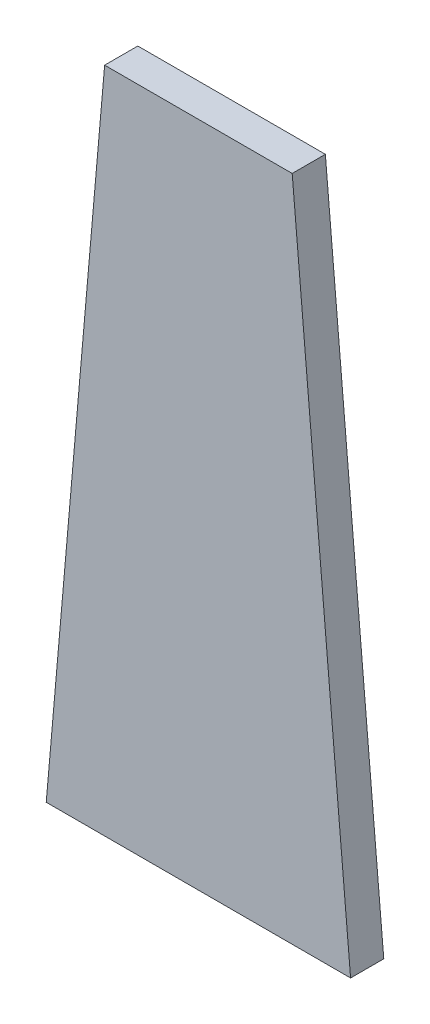
ISO-10303-21;
HEADER;
FILE_DESCRIPTION(('STEP AP214'),'2;1');
FILE_NAME('part.step','',(''),(''),'','','');
FILE_SCHEMA(('AUTOMOTIVE_DESIGN { 1 0 10303 214 1 1 1 1 }'));
ENDSEC;
DATA;
#1=APPLICATION_CONTEXT('core data for automotive mechanical design processes');
#2=APPLICATION_PROTOCOL_DEFINITION('international standard','automotive_design',2000,#1);
#3=PRODUCT_CONTEXT('',#1,'mechanical');
#4=PRODUCT('Part','Part','',(#3));
#5=PRODUCT_RELATED_PRODUCT_CATEGORY('part','',(#4));
#6=PRODUCT_DEFINITION_FORMATION('','',#4);
#7=PRODUCT_DEFINITION_CONTEXT('part definition',#1,'design');
#8=PRODUCT_DEFINITION('design','',#6,#7);
#9=PRODUCT_DEFINITION_SHAPE('','',#8);
#10=(LENGTH_UNIT() NAMED_UNIT(*) SI_UNIT(.MILLI.,.METRE.));
#11=(NAMED_UNIT(*) PLANE_ANGLE_UNIT() SI_UNIT($,.RADIAN.));
#12=(NAMED_UNIT(*) SI_UNIT($,.STERADIAN.) SOLID_ANGLE_UNIT());
#13=UNCERTAINTY_MEASURE_WITH_UNIT(LENGTH_MEASURE(1.E-05),#10,'distance_accuracy_value','');
#14=(GEOMETRIC_REPRESENTATION_CONTEXT(3) GLOBAL_UNCERTAINTY_ASSIGNED_CONTEXT((#13)) GLOBAL_UNIT_ASSIGNED_CONTEXT((#10,
#11,#12)) REPRESENTATION_CONTEXT('',''));
#15=CARTESIAN_POINT('',(0.,0.,0.));
#16=DIRECTION('',(0.,0.,1.));
#17=DIRECTION('',(1.,0.,0.));
#18=AXIS2_PLACEMENT_3D('',#15,#16,#17);
#19=CARTESIAN_POINT('',(-9.1740130367215,-20.121840140689,2.));
#20=DIRECTION('',(0.996194717842911,-0.0871555169905064,0.));
#21=DIRECTION('',(0.0871555169905064,0.996194717842911,0.));
#22=AXIS2_PLACEMENT_3D('',#19,#20,#21);
#23=PLANE('',#22);
#24=DIRECTION('',(-0.0871555169905064,-0.996194717842911,0.));
#25=VECTOR('',#24,1.);
#26=CARTESIAN_POINT('',(-9.1740130367215,-20.121840140689,0.));
#27=LINE('',#26,#25);
#28=CARTESIAN_POINT('',(-5.65315642334883,20.121840140689,0.));
#29=VERTEX_POINT('',#28);
#30=CARTESIAN_POINT('',(-9.1740130367215,-20.121840140689,0.));
#31=VERTEX_POINT('',#30);
#32=EDGE_CURVE('E99',#29,#31,#27,.T.);
#33=ORIENTED_EDGE('',*,*,#32,.T.);
#34=DIRECTION('',(0.,0.,-1.));
#35=VECTOR('',#34,1.);
#36=CARTESIAN_POINT('',(-9.1740130367215,-20.121840140689,2.));
#37=LINE('',#36,#35);
#38=CARTESIAN_POINT('',(-9.1740130367215,-20.121840140689,2.));
#39=VERTEX_POINT('',#38);
#40=EDGE_CURVE('E11',#39,#31,#37,.T.);
#41=ORIENTED_EDGE('',*,*,#40,.F.);
#42=DIRECTION('',(-0.0871555169905064,-0.996194717842911,0.));
#43=VECTOR('',#42,1.);
#44=CARTESIAN_POINT('',(-9.1740130367215,-20.121840140689,2.));
#45=LINE('',#44,#43);
#46=CARTESIAN_POINT('',(-5.65315642334883,20.121840140689,2.));
#47=VERTEX_POINT('',#46);
#48=EDGE_CURVE('E87',#47,#39,#45,.T.);
#49=ORIENTED_EDGE('',*,*,#48,.F.);
#50=DIRECTION('',(0.,0.,-1.));
#51=VECTOR('',#50,1.);
#52=CARTESIAN_POINT('',(-5.65315642334883,20.121840140689,2.));
#53=LINE('',#52,#51);
#54=EDGE_CURVE('E95',#47,#29,#53,.T.);
#55=ORIENTED_EDGE('',*,*,#54,.T.);
#56=EDGE_LOOP('',(#33,#41,#49,#55));
#57=FACE_BOUND('',#56,.T.);
#58=ADVANCED_FACE('F36',(#57),#23,.F.);
#59=CARTESIAN_POINT('',(9.1740130367215,-20.121840140689,2.));
#60=DIRECTION('',(0.,1.,0.));
#61=DIRECTION('',(0.,0.,1.));
#62=AXIS2_PLACEMENT_3D('',#59,#60,#61);
#63=PLANE('',#62);
#64=DIRECTION('',(1.,0.,0.));
#65=VECTOR('',#64,1.);
#66=CARTESIAN_POINT('',(9.1740130367215,-20.121840140689,0.));
#67=LINE('',#66,#65);
#68=CARTESIAN_POINT('',(9.1740130367215,-20.121840140689,0.));
#69=VERTEX_POINT('',#68);
#70=EDGE_CURVE('E91',#31,#69,#67,.T.);
#71=ORIENTED_EDGE('',*,*,#70,.T.);
#72=DIRECTION('',(0.,0.,-1.));
#73=VECTOR('',#72,1.);
#74=CARTESIAN_POINT('',(9.1740130367215,-20.121840140689,2.));
#75=LINE('',#74,#73);
#76=CARTESIAN_POINT('',(9.1740130367215,-20.121840140689,2.));
#77=VERTEX_POINT('',#76);
#78=EDGE_CURVE('E44',#77,#69,#75,.T.);
#79=ORIENTED_EDGE('',*,*,#78,.F.);
#80=DIRECTION('',(1.,0.,0.));
#81=VECTOR('',#80,1.);
#82=CARTESIAN_POINT('',(9.1740130367215,-20.121840140689,2.));
#83=LINE('',#82,#81);
#84=EDGE_CURVE('E82',#39,#77,#83,.T.);
#85=ORIENTED_EDGE('',*,*,#84,.F.);
#86=ORIENTED_EDGE('',*,*,#40,.T.);
#87=EDGE_LOOP('',(#71,#79,#85,#86));
#88=FACE_BOUND('',#87,.T.);
#89=ADVANCED_FACE('F90',(#88),#63,.F.);
#90=CARTESIAN_POINT('',(5.65315642330453,20.121840140689,2.));
#91=DIRECTION('',(-0.996194717842816,-0.0871555169915947,0.));
#92=DIRECTION('',(0.0871555169915947,-0.996194717842816,0.));
#93=AXIS2_PLACEMENT_3D('',#90,#91,#92);
#94=PLANE('',#93);
#95=DIRECTION('',(-0.0871555169915947,0.996194717842816,0.));
#96=VECTOR('',#95,1.);
#97=CARTESIAN_POINT('',(5.65315642330453,20.121840140689,0.));
#98=LINE('',#97,#96);
#99=CARTESIAN_POINT('',(5.65315642330453,20.121840140689,0.));
#100=VERTEX_POINT('',#99);
#101=EDGE_CURVE('E69',#69,#100,#98,.T.);
#102=ORIENTED_EDGE('',*,*,#101,.T.);
#103=DIRECTION('',(0.,0.,-1.));
#104=VECTOR('',#103,1.);
#105=CARTESIAN_POINT('',(5.65315642330453,20.121840140689,2.));
#106=LINE('',#105,#104);
#107=CARTESIAN_POINT('',(5.65315642330453,20.121840140689,2.));
#108=VERTEX_POINT('',#107);
#109=EDGE_CURVE('E92',#108,#100,#106,.T.);
#110=ORIENTED_EDGE('',*,*,#109,.F.);
#111=DIRECTION('',(-0.0871555169915947,0.996194717842816,0.));
#112=VECTOR('',#111,1.);
#113=CARTESIAN_POINT('',(5.65315642330453,20.121840140689,2.));
#114=LINE('',#113,#112);
#115=EDGE_CURVE('E85',#77,#108,#114,.T.);
#116=ORIENTED_EDGE('',*,*,#115,.F.);
#117=ORIENTED_EDGE('',*,*,#78,.T.);
#118=EDGE_LOOP('',(#102,#110,#116,#117));
#119=FACE_BOUND('',#118,.T.);
#120=ADVANCED_FACE('F93',(#119),#94,.F.);
#121=CARTESIAN_POINT('',(-5.65315642334883,20.121840140689,2.));
#122=DIRECTION('',(0.,-1.,0.));
#123=DIRECTION('',(0.,0.,-1.));
#124=AXIS2_PLACEMENT_3D('',#121,#122,#123);
#125=PLANE('',#124);
#126=DIRECTION('',(-1.,0.,0.));
#127=VECTOR('',#126,1.);
#128=CARTESIAN_POINT('',(-5.65315642334883,20.121840140689,0.));
#129=LINE('',#128,#127);
#130=EDGE_CURVE('E75',#100,#29,#129,.T.);
#131=ORIENTED_EDGE('',*,*,#130,.T.);
#132=ORIENTED_EDGE('',*,*,#54,.F.);
#133=DIRECTION('',(-1.,0.,0.));
#134=VECTOR('',#133,1.);
#135=CARTESIAN_POINT('',(-5.65315642334883,20.121840140689,2.));
#136=LINE('',#135,#134);
#137=EDGE_CURVE('E52',#108,#47,#136,.T.);
#138=ORIENTED_EDGE('',*,*,#137,.F.);
#139=ORIENTED_EDGE('',*,*,#109,.T.);
#140=EDGE_LOOP('',(#131,#132,#138,#139));
#141=FACE_BOUND('',#140,.T.);
#142=ADVANCED_FACE('F106',(#141),#125,.F.);
#143=CARTESIAN_POINT('',(0.,0.,2.));
#144=DIRECTION('',(0.,0.,-1.));
#145=DIRECTION('',(-1.,0.,0.));
#146=AXIS2_PLACEMENT_3D('',#143,#144,#145);
#147=PLANE('',#146);
#148=ORIENTED_EDGE('',*,*,#48,.T.);
#149=ORIENTED_EDGE('',*,*,#84,.T.);
#150=ORIENTED_EDGE('',*,*,#115,.T.);
#151=ORIENTED_EDGE('',*,*,#137,.T.);
#152=EDGE_LOOP('',(#148,#149,#150,#151));
#153=FACE_BOUND('',#152,.T.);
#154=ADVANCED_FACE('F83',(#153),#147,.F.);
#155=CARTESIAN_POINT('',(0.,0.,0.));
#156=DIRECTION('',(0.,0.,-1.));
#157=DIRECTION('',(-1.,0.,0.));
#158=AXIS2_PLACEMENT_3D('',#155,#156,#157);
#159=PLANE('',#158);
#160=ORIENTED_EDGE('',*,*,#32,.F.);
#161=ORIENTED_EDGE('',*,*,#130,.F.);
#162=ORIENTED_EDGE('',*,*,#101,.F.);
#163=ORIENTED_EDGE('',*,*,#70,.F.);
#164=EDGE_LOOP('',(#160,#161,#162,#163));
#165=FACE_BOUND('',#164,.T.);
#166=ADVANCED_FACE('F109',(#165),#159,.T.);
#167=CLOSED_SHELL('',(#58,#89,#120,#142,#154,#166));
#168=MANIFOLD_SOLID_BREP('B2',#167);
#169=ADVANCED_BREP_SHAPE_REPRESENTATION('',(#18,#168),#14);
#170=SHAPE_DEFINITION_REPRESENTATION(#9,#169);
ENDSEC;
END-ISO-10303-21;
